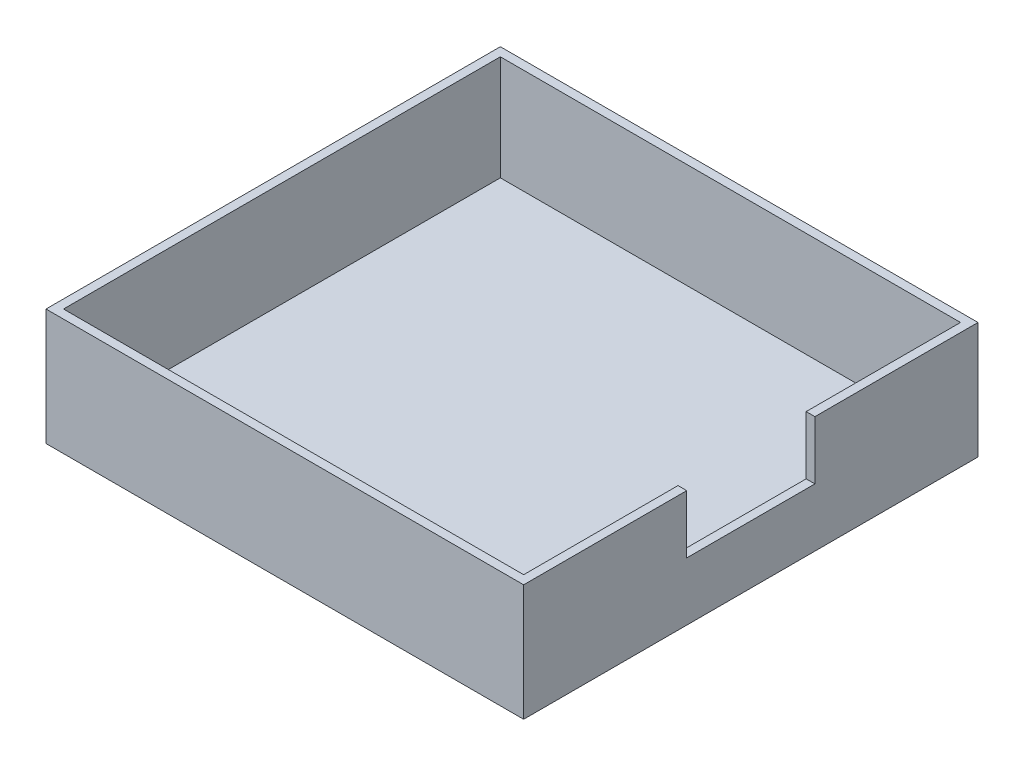
ISO-10303-21;
HEADER;
FILE_DESCRIPTION(('STEP AP214'),'2;1');
FILE_NAME('part.step','',(''),(''),'','','');
FILE_SCHEMA(('AUTOMOTIVE_DESIGN { 1 0 10303 214 1 1 1 1 }'));
ENDSEC;
DATA;
#1=APPLICATION_CONTEXT('core data for automotive mechanical design processes');
#2=APPLICATION_PROTOCOL_DEFINITION('international standard','automotive_design',2000,#1);
#3=PRODUCT_CONTEXT('',#1,'mechanical');
#4=PRODUCT('Part','Part','',(#3));
#5=PRODUCT_RELATED_PRODUCT_CATEGORY('part','',(#4));
#6=PRODUCT_DEFINITION_FORMATION('','',#4);
#7=PRODUCT_DEFINITION_CONTEXT('part definition',#1,'design');
#8=PRODUCT_DEFINITION('design','',#6,#7);
#9=PRODUCT_DEFINITION_SHAPE('','',#8);
#10=(LENGTH_UNIT() NAMED_UNIT(*) SI_UNIT(.MILLI.,.METRE.));
#11=(NAMED_UNIT(*) PLANE_ANGLE_UNIT() SI_UNIT($,.RADIAN.));
#12=(NAMED_UNIT(*) SI_UNIT($,.STERADIAN.) SOLID_ANGLE_UNIT());
#13=UNCERTAINTY_MEASURE_WITH_UNIT(LENGTH_MEASURE(1.E-05),#10,'distance_accuracy_value','');
#14=(GEOMETRIC_REPRESENTATION_CONTEXT(3) GLOBAL_UNCERTAINTY_ASSIGNED_CONTEXT((#13)) GLOBAL_UNIT_ASSIGNED_CONTEXT((#10,
#11,#12)) REPRESENTATION_CONTEXT('',''));
#15=CARTESIAN_POINT('',(0.,0.,0.));
#16=DIRECTION('',(0.,0.,1.));
#17=DIRECTION('',(1.,0.,0.));
#18=AXIS2_PLACEMENT_3D('',#15,#16,#17);
#19=CARTESIAN_POINT('',(0.,2.,0.));
#20=DIRECTION('',(0.,-1.,0.));
#21=DIRECTION('',(0.,0.,-1.));
#22=AXIS2_PLACEMENT_3D('',#19,#20,#21);
#23=PLANE('',#22);
#24=DIRECTION('',(1.,0.,0.));
#25=VECTOR('',#24,1.);
#26=CARTESIAN_POINT('',(-39.5,2.,37.5));
#27=LINE('',#26,#25);
#28=CARTESIAN_POINT('',(-39.5,2.,37.5));
#29=VERTEX_POINT('',#28);
#30=CARTESIAN_POINT('',(39.5,2.,37.5));
#31=VERTEX_POINT('',#30);
#32=EDGE_CURVE('E143',#29,#31,#27,.T.);
#33=ORIENTED_EDGE('',*,*,#32,.T.);
#34=DIRECTION('',(0.,0.,1.));
#35=VECTOR('',#34,1.);
#36=CARTESIAN_POINT('',(39.5,2.,-37.5));
#37=LINE('',#36,#35);
#38=CARTESIAN_POINT('',(39.5,2.,-37.5));
#39=VERTEX_POINT('',#38);
#40=EDGE_CURVE('E247',#39,#31,#37,.T.);
#41=ORIENTED_EDGE('',*,*,#40,.F.);
#42=DIRECTION('',(1.,0.,0.));
#43=VECTOR('',#42,1.);
#44=CARTESIAN_POINT('',(-39.5,2.,-37.5));
#45=LINE('',#44,#43);
#46=CARTESIAN_POINT('',(-39.5,2.,-37.5));
#47=VERTEX_POINT('',#46);
#48=EDGE_CURVE('E54',#47,#39,#45,.T.);
#49=ORIENTED_EDGE('',*,*,#48,.F.);
#50=DIRECTION('',(0.,0.,1.));
#51=VECTOR('',#50,1.);
#52=CARTESIAN_POINT('',(-39.5,2.,-37.5));
#53=LINE('',#52,#51);
#54=EDGE_CURVE('E11',#47,#29,#53,.T.);
#55=ORIENTED_EDGE('',*,*,#54,.T.);
#56=EDGE_LOOP('',(#33,#41,#49,#55));
#57=FACE_BOUND('',#56,.T.);
#58=ADVANCED_FACE('F45',(#57),#23,.F.);
#59=CARTESIAN_POINT('',(0.,0.,0.));
#60=DIRECTION('',(0.,-1.,0.));
#61=DIRECTION('',(0.,0.,-1.));
#62=AXIS2_PLACEMENT_3D('',#59,#60,#61);
#63=PLANE('',#62);
#64=DIRECTION('',(1.,0.,0.));
#65=VECTOR('',#64,1.);
#66=CARTESIAN_POINT('',(0.,0.,-39.));
#67=LINE('',#66,#65);
#68=CARTESIAN_POINT('',(-41.,0.,-39.));
#69=VERTEX_POINT('',#68);
#70=CARTESIAN_POINT('',(41.,0.,-39.));
#71=VERTEX_POINT('',#70);
#72=EDGE_CURVE('E197',#69,#71,#67,.T.);
#73=ORIENTED_EDGE('',*,*,#72,.T.);
#74=DIRECTION('',(0.,0.,1.));
#75=VECTOR('',#74,1.);
#76=CARTESIAN_POINT('',(41.,0.,0.));
#77=LINE('',#76,#75);
#78=CARTESIAN_POINT('',(41.,0.,39.));
#79=VERTEX_POINT('',#78);
#80=EDGE_CURVE('E161',#71,#79,#77,.T.);
#81=ORIENTED_EDGE('',*,*,#80,.T.);
#82=DIRECTION('',(1.,0.,0.));
#83=VECTOR('',#82,1.);
#84=CARTESIAN_POINT('',(0.,0.,39.));
#85=LINE('',#84,#83);
#86=CARTESIAN_POINT('',(-41.,0.,39.));
#87=VERTEX_POINT('',#86);
#88=EDGE_CURVE('E165',#87,#79,#85,.T.);
#89=ORIENTED_EDGE('',*,*,#88,.F.);
#90=DIRECTION('',(0.,0.,1.));
#91=VECTOR('',#90,1.);
#92=CARTESIAN_POINT('',(-41.,0.,0.));
#93=LINE('',#92,#91);
#94=EDGE_CURVE('E201',#69,#87,#93,.T.);
#95=ORIENTED_EDGE('',*,*,#94,.F.);
#96=EDGE_LOOP('',(#73,#81,#89,#95));
#97=FACE_BOUND('',#96,.T.);
#98=ADVANCED_FACE('F47',(#97),#63,.T.);
#99=CARTESIAN_POINT('',(39.5,20.,0.));
#100=DIRECTION('',(1.,0.,0.));
#101=DIRECTION('',(0.,0.,-1.));
#102=AXIS2_PLACEMENT_3D('',#99,#100,#101);
#103=PLANE('',#102);
#104=DIRECTION('',(0.,-1.,0.));
#105=VECTOR('',#104,1.);
#106=CARTESIAN_POINT('',(39.5,20.,11.));
#107=LINE('',#106,#105);
#108=CARTESIAN_POINT('',(39.5,20.,11.));
#109=VERTEX_POINT('',#108);
#110=CARTESIAN_POINT('',(39.5,10.,11.));
#111=VERTEX_POINT('',#110);
#112=EDGE_CURVE('E134',#109,#111,#107,.T.);
#113=ORIENTED_EDGE('',*,*,#112,.T.);
#114=DIRECTION('',(0.,0.,1.));
#115=VECTOR('',#114,1.);
#116=CARTESIAN_POINT('',(39.5,10.,0.));
#117=LINE('',#116,#115);
#118=CARTESIAN_POINT('',(39.5,10.,-11.));
#119=VERTEX_POINT('',#118);
#120=EDGE_CURVE('E266',#119,#111,#117,.T.);
#121=ORIENTED_EDGE('',*,*,#120,.F.);
#122=DIRECTION('',(0.,-1.,0.));
#123=VECTOR('',#122,1.);
#124=CARTESIAN_POINT('',(39.5,20.,-11.));
#125=LINE('',#124,#123);
#126=CARTESIAN_POINT('',(39.5,20.,-11.));
#127=VERTEX_POINT('',#126);
#128=EDGE_CURVE('E69',#127,#119,#125,.T.);
#129=ORIENTED_EDGE('',*,*,#128,.F.);
#130=DIRECTION('',(0.,0.,1.));
#131=VECTOR('',#130,1.);
#132=CARTESIAN_POINT('',(39.5,20.,0.));
#133=LINE('',#132,#131);
#134=CARTESIAN_POINT('',(39.5,20.,-37.5));
#135=VERTEX_POINT('',#134);
#136=EDGE_CURVE('E156',#135,#127,#133,.T.);
#137=ORIENTED_EDGE('',*,*,#136,.F.);
#138=DIRECTION('',(0.,-1.,0.));
#139=VECTOR('',#138,1.);
#140=CARTESIAN_POINT('',(39.5,20.,-37.5));
#141=LINE('',#140,#139);
#142=EDGE_CURVE('E230',#135,#39,#141,.T.);
#143=ORIENTED_EDGE('',*,*,#142,.T.);
#144=ORIENTED_EDGE('',*,*,#40,.T.);
#145=DIRECTION('',(0.,-1.,0.));
#146=VECTOR('',#145,1.);
#147=CARTESIAN_POINT('',(39.5,20.,37.5));
#148=LINE('',#147,#146);
#149=CARTESIAN_POINT('',(39.5,20.,37.5));
#150=VERTEX_POINT('',#149);
#151=EDGE_CURVE('E144',#150,#31,#148,.T.);
#152=ORIENTED_EDGE('',*,*,#151,.F.);
#153=EDGE_CURVE('E147',#109,#150,#133,.T.);
#154=ORIENTED_EDGE('',*,*,#153,.F.);
#155=EDGE_LOOP('',(#113,#121,#129,#137,#143,#144,#152,#154));
#156=FACE_BOUND('',#155,.T.);
#157=ADVANCED_FACE('F148',(#156),#103,.F.);
#158=CARTESIAN_POINT('',(0.,20.,37.5));
#159=DIRECTION('',(0.,0.,-1.));
#160=DIRECTION('',(-1.,0.,0.));
#161=AXIS2_PLACEMENT_3D('',#158,#159,#160);
#162=PLANE('',#161);
#163=ORIENTED_EDGE('',*,*,#32,.F.);
#164=DIRECTION('',(0.,-1.,0.));
#165=VECTOR('',#164,1.);
#166=CARTESIAN_POINT('',(-39.5,20.,37.5));
#167=LINE('',#166,#165);
#168=CARTESIAN_POINT('',(-39.5,20.,37.5));
#169=VERTEX_POINT('',#168);
#170=EDGE_CURVE('E238',#169,#29,#167,.T.);
#171=ORIENTED_EDGE('',*,*,#170,.F.);
#172=DIRECTION('',(1.,0.,0.));
#173=VECTOR('',#172,1.);
#174=CARTESIAN_POINT('',(0.,20.,37.5));
#175=LINE('',#174,#173);
#176=EDGE_CURVE('E154',#169,#150,#175,.T.);
#177=ORIENTED_EDGE('',*,*,#176,.T.);
#178=ORIENTED_EDGE('',*,*,#151,.T.);
#179=EDGE_LOOP('',(#163,#171,#177,#178));
#180=FACE_BOUND('',#179,.T.);
#181=ADVANCED_FACE('F259',(#180),#162,.T.);
#182=CARTESIAN_POINT('',(-39.5,20.,0.));
#183=DIRECTION('',(1.,0.,0.));
#184=DIRECTION('',(0.,0.,-1.));
#185=AXIS2_PLACEMENT_3D('',#182,#183,#184);
#186=PLANE('',#185);
#187=ORIENTED_EDGE('',*,*,#54,.F.);
#188=DIRECTION('',(0.,-1.,0.));
#189=VECTOR('',#188,1.);
#190=CARTESIAN_POINT('',(-39.5,20.,-37.5));
#191=LINE('',#190,#189);
#192=CARTESIAN_POINT('',(-39.5,20.,-37.5));
#193=VERTEX_POINT('',#192);
#194=EDGE_CURVE('E234',#193,#47,#191,.T.);
#195=ORIENTED_EDGE('',*,*,#194,.F.);
#196=DIRECTION('',(0.,0.,1.));
#197=VECTOR('',#196,1.);
#198=CARTESIAN_POINT('',(-39.5,20.,0.));
#199=LINE('',#198,#197);
#200=EDGE_CURVE('E173',#193,#169,#199,.T.);
#201=ORIENTED_EDGE('',*,*,#200,.T.);
#202=ORIENTED_EDGE('',*,*,#170,.T.);
#203=EDGE_LOOP('',(#187,#195,#201,#202));
#204=FACE_BOUND('',#203,.T.);
#205=ADVANCED_FACE('F261',(#204),#186,.T.);
#206=CARTESIAN_POINT('',(0.,20.,-37.5));
#207=DIRECTION('',(0.,0.,-1.));
#208=DIRECTION('',(-1.,0.,0.));
#209=AXIS2_PLACEMENT_3D('',#206,#207,#208);
#210=PLANE('',#209);
#211=ORIENTED_EDGE('',*,*,#194,.T.);
#212=ORIENTED_EDGE('',*,*,#48,.T.);
#213=ORIENTED_EDGE('',*,*,#142,.F.);
#214=DIRECTION('',(1.,0.,0.));
#215=VECTOR('',#214,1.);
#216=CARTESIAN_POINT('',(0.,20.,-37.5));
#217=LINE('',#216,#215);
#218=EDGE_CURVE('E177',#193,#135,#217,.T.);
#219=ORIENTED_EDGE('',*,*,#218,.F.);
#220=EDGE_LOOP('',(#211,#212,#213,#219));
#221=FACE_BOUND('',#220,.T.);
#222=ADVANCED_FACE('F253',(#221),#210,.F.);
#223=CARTESIAN_POINT('',(0.,20.,11.));
#224=DIRECTION('',(0.,0.,-1.));
#225=DIRECTION('',(-1.,0.,0.));
#226=AXIS2_PLACEMENT_3D('',#223,#224,#225);
#227=PLANE('',#226);
#228=DIRECTION('',(1.,0.,0.));
#229=VECTOR('',#228,1.);
#230=CARTESIAN_POINT('',(0.,10.,11.));
#231=LINE('',#230,#229);
#232=CARTESIAN_POINT('',(41.,10.,11.));
#233=VERTEX_POINT('',#232);
#234=EDGE_CURVE('E61',#111,#233,#231,.T.);
#235=ORIENTED_EDGE('',*,*,#234,.F.);
#236=ORIENTED_EDGE('',*,*,#112,.F.);
#237=DIRECTION('',(1.,0.,0.));
#238=VECTOR('',#237,1.);
#239=CARTESIAN_POINT('',(0.,20.,11.));
#240=LINE('',#239,#238);
#241=CARTESIAN_POINT('',(41.,20.,11.));
#242=VERTEX_POINT('',#241);
#243=EDGE_CURVE('E138',#109,#242,#240,.T.);
#244=ORIENTED_EDGE('',*,*,#243,.T.);
#245=DIRECTION('',(0.,-1.,0.));
#246=VECTOR('',#245,1.);
#247=CARTESIAN_POINT('',(41.,20.,11.));
#248=LINE('',#247,#246);
#249=EDGE_CURVE('E207',#242,#233,#248,.T.);
#250=ORIENTED_EDGE('',*,*,#249,.T.);
#251=EDGE_LOOP('',(#235,#236,#244,#250));
#252=FACE_BOUND('',#251,.T.);
#253=ADVANCED_FACE('F136',(#252),#227,.T.);
#254=CARTESIAN_POINT('',(0.,20.,-11.));
#255=DIRECTION('',(0.,0.,-1.));
#256=DIRECTION('',(-1.,0.,0.));
#257=AXIS2_PLACEMENT_3D('',#254,#255,#256);
#258=PLANE('',#257);
#259=ORIENTED_EDGE('',*,*,#128,.T.);
#260=DIRECTION('',(1.,0.,0.));
#261=VECTOR('',#260,1.);
#262=CARTESIAN_POINT('',(0.,10.,-11.));
#263=LINE('',#262,#261);
#264=CARTESIAN_POINT('',(41.,10.,-11.));
#265=VERTEX_POINT('',#264);
#266=EDGE_CURVE('E168',#119,#265,#263,.T.);
#267=ORIENTED_EDGE('',*,*,#266,.T.);
#268=DIRECTION('',(0.,-1.,0.));
#269=VECTOR('',#268,1.);
#270=CARTESIAN_POINT('',(41.,20.,-11.));
#271=LINE('',#270,#269);
#272=CARTESIAN_POINT('',(41.,20.,-11.));
#273=VERTEX_POINT('',#272);
#274=EDGE_CURVE('E224',#273,#265,#271,.T.);
#275=ORIENTED_EDGE('',*,*,#274,.F.);
#276=DIRECTION('',(1.,0.,0.));
#277=VECTOR('',#276,1.);
#278=CARTESIAN_POINT('',(0.,20.,-11.));
#279=LINE('',#278,#277);
#280=EDGE_CURVE('E180',#127,#273,#279,.T.);
#281=ORIENTED_EDGE('',*,*,#280,.F.);
#282=EDGE_LOOP('',(#259,#267,#275,#281));
#283=FACE_BOUND('',#282,.T.);
#284=ADVANCED_FACE('F268',(#283),#258,.F.);
#285=CARTESIAN_POINT('',(41.,20.,0.));
#286=DIRECTION('',(1.,0.,0.));
#287=DIRECTION('',(0.,0.,-1.));
#288=AXIS2_PLACEMENT_3D('',#285,#286,#287);
#289=PLANE('',#288);
#290=ORIENTED_EDGE('',*,*,#80,.F.);
#291=DIRECTION('',(0.,-1.,0.));
#292=VECTOR('',#291,1.);
#293=CARTESIAN_POINT('',(41.,20.,-39.));
#294=LINE('',#293,#292);
#295=CARTESIAN_POINT('',(41.,20.,-39.));
#296=VERTEX_POINT('',#295);
#297=EDGE_CURVE('E220',#296,#71,#294,.T.);
#298=ORIENTED_EDGE('',*,*,#297,.F.);
#299=DIRECTION('',(0.,0.,1.));
#300=VECTOR('',#299,1.);
#301=CARTESIAN_POINT('',(41.,20.,0.));
#302=LINE('',#301,#300);
#303=EDGE_CURVE('E183',#296,#273,#302,.T.);
#304=ORIENTED_EDGE('',*,*,#303,.T.);
#305=ORIENTED_EDGE('',*,*,#274,.T.);
#306=DIRECTION('',(0.,0.,1.));
#307=VECTOR('',#306,1.);
#308=CARTESIAN_POINT('',(41.,10.,0.));
#309=LINE('',#308,#307);
#310=EDGE_CURVE('E288',#265,#233,#309,.T.);
#311=ORIENTED_EDGE('',*,*,#310,.T.);
#312=ORIENTED_EDGE('',*,*,#249,.F.);
#313=CARTESIAN_POINT('',(41.,20.,39.));
#314=VERTEX_POINT('',#313);
#315=EDGE_CURVE('E159',#242,#314,#302,.T.);
#316=ORIENTED_EDGE('',*,*,#315,.T.);
#317=DIRECTION('',(0.,-1.,0.));
#318=VECTOR('',#317,1.);
#319=CARTESIAN_POINT('',(41.,20.,39.));
#320=LINE('',#319,#318);
#321=EDGE_CURVE('E210',#314,#79,#320,.T.);
#322=ORIENTED_EDGE('',*,*,#321,.T.);
#323=EDGE_LOOP('',(#290,#298,#304,#305,#311,#312,#316,#322));
#324=FACE_BOUND('',#323,.T.);
#325=ADVANCED_FACE('F272',(#324),#289,.T.);
#326=CARTESIAN_POINT('',(0.,20.,-39.));
#327=DIRECTION('',(0.,0.,-1.));
#328=DIRECTION('',(-1.,0.,0.));
#329=AXIS2_PLACEMENT_3D('',#326,#327,#328);
#330=PLANE('',#329);
#331=ORIENTED_EDGE('',*,*,#72,.F.);
#332=DIRECTION('',(0.,-1.,0.));
#333=VECTOR('',#332,1.);
#334=CARTESIAN_POINT('',(-41.,20.,-39.));
#335=LINE('',#334,#333);
#336=CARTESIAN_POINT('',(-41.,20.,-39.));
#337=VERTEX_POINT('',#336);
#338=EDGE_CURVE('E217',#337,#69,#335,.T.);
#339=ORIENTED_EDGE('',*,*,#338,.F.);
#340=DIRECTION('',(1.,0.,0.));
#341=VECTOR('',#340,1.);
#342=CARTESIAN_POINT('',(0.,20.,-39.));
#343=LINE('',#342,#341);
#344=EDGE_CURVE('E187',#337,#296,#343,.T.);
#345=ORIENTED_EDGE('',*,*,#344,.T.);
#346=ORIENTED_EDGE('',*,*,#297,.T.);
#347=EDGE_LOOP('',(#331,#339,#345,#346));
#348=FACE_BOUND('',#347,.T.);
#349=ADVANCED_FACE('F276',(#348),#330,.T.);
#350=CARTESIAN_POINT('',(-41.,20.,0.));
#351=DIRECTION('',(1.,0.,0.));
#352=DIRECTION('',(0.,0.,-1.));
#353=AXIS2_PLACEMENT_3D('',#350,#351,#352);
#354=PLANE('',#353);
#355=ORIENTED_EDGE('',*,*,#94,.T.);
#356=DIRECTION('',(0.,-1.,0.));
#357=VECTOR('',#356,1.);
#358=CARTESIAN_POINT('',(-41.,20.,39.));
#359=LINE('',#358,#357);
#360=CARTESIAN_POINT('',(-41.,20.,39.));
#361=VERTEX_POINT('',#360);
#362=EDGE_CURVE('E213',#361,#87,#359,.T.);
#363=ORIENTED_EDGE('',*,*,#362,.F.);
#364=DIRECTION('',(0.,0.,1.));
#365=VECTOR('',#364,1.);
#366=CARTESIAN_POINT('',(-41.,20.,0.));
#367=LINE('',#366,#365);
#368=EDGE_CURVE('E191',#337,#361,#367,.T.);
#369=ORIENTED_EDGE('',*,*,#368,.F.);
#370=ORIENTED_EDGE('',*,*,#338,.T.);
#371=EDGE_LOOP('',(#355,#363,#369,#370));
#372=FACE_BOUND('',#371,.T.);
#373=ADVANCED_FACE('F281',(#372),#354,.F.);
#374=CARTESIAN_POINT('',(0.,20.,39.));
#375=DIRECTION('',(0.,0.,-1.));
#376=DIRECTION('',(-1.,0.,0.));
#377=AXIS2_PLACEMENT_3D('',#374,#375,#376);
#378=PLANE('',#377);
#379=ORIENTED_EDGE('',*,*,#88,.T.);
#380=ORIENTED_EDGE('',*,*,#321,.F.);
#381=DIRECTION('',(1.,0.,0.));
#382=VECTOR('',#381,1.);
#383=CARTESIAN_POINT('',(0.,20.,39.));
#384=LINE('',#383,#382);
#385=EDGE_CURVE('E194',#361,#314,#384,.T.);
#386=ORIENTED_EDGE('',*,*,#385,.F.);
#387=ORIENTED_EDGE('',*,*,#362,.T.);
#388=EDGE_LOOP('',(#379,#380,#386,#387));
#389=FACE_BOUND('',#388,.T.);
#390=ADVANCED_FACE('F285',(#389),#378,.F.);
#391=CARTESIAN_POINT('',(0.,20.,0.));
#392=DIRECTION('',(0.,1.,0.));
#393=DIRECTION('',(0.,0.,1.));
#394=AXIS2_PLACEMENT_3D('',#391,#392,#393);
#395=PLANE('',#394);
#396=ORIENTED_EDGE('',*,*,#243,.F.);
#397=ORIENTED_EDGE('',*,*,#153,.T.);
#398=ORIENTED_EDGE('',*,*,#176,.F.);
#399=ORIENTED_EDGE('',*,*,#200,.F.);
#400=ORIENTED_EDGE('',*,*,#218,.T.);
#401=ORIENTED_EDGE('',*,*,#136,.T.);
#402=ORIENTED_EDGE('',*,*,#280,.T.);
#403=ORIENTED_EDGE('',*,*,#303,.F.);
#404=ORIENTED_EDGE('',*,*,#344,.F.);
#405=ORIENTED_EDGE('',*,*,#368,.T.);
#406=ORIENTED_EDGE('',*,*,#385,.T.);
#407=ORIENTED_EDGE('',*,*,#315,.F.);
#408=EDGE_LOOP('',(#396,#397,#398,#399,#400,#401,#402,#403,#404,#405,#406,#407));
#409=FACE_BOUND('',#408,.T.);
#410=ADVANCED_FACE('F157',(#409),#395,.T.);
#411=CARTESIAN_POINT('',(0.,10.,0.));
#412=DIRECTION('',(0.,1.,0.));
#413=DIRECTION('',(0.,0.,1.));
#414=AXIS2_PLACEMENT_3D('',#411,#412,#413);
#415=PLANE('',#414);
#416=ORIENTED_EDGE('',*,*,#120,.T.);
#417=ORIENTED_EDGE('',*,*,#234,.T.);
#418=ORIENTED_EDGE('',*,*,#310,.F.);
#419=ORIENTED_EDGE('',*,*,#266,.F.);
#420=EDGE_LOOP('',(#416,#417,#418,#419));
#421=FACE_BOUND('',#420,.T.);
#422=ADVANCED_FACE('F290',(#421),#415,.T.);
#423=CLOSED_SHELL('',(#58,#98,#157,#181,#205,#222,#253,#284,#325,#349,#373,#390,#410,#422));
#424=MANIFOLD_SOLID_BREP('B2',#423);
#425=ADVANCED_BREP_SHAPE_REPRESENTATION('',(#18,#424),#14);
#426=SHAPE_DEFINITION_REPRESENTATION(#9,#425);
ENDSEC;
END-ISO-10303-21;
